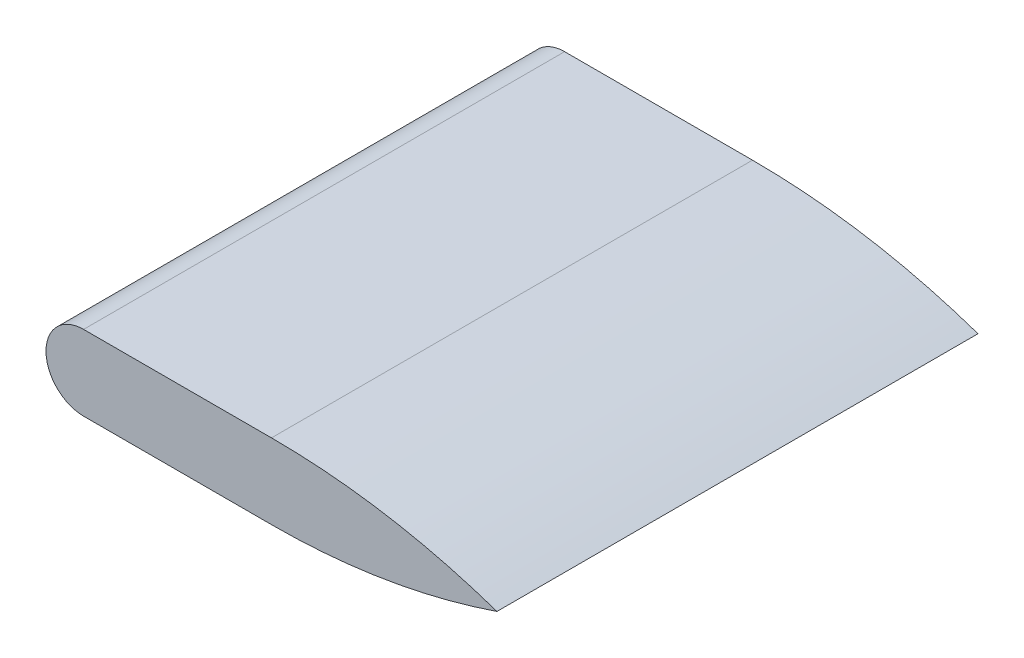
ISO-10303-21;
HEADER;
FILE_DESCRIPTION(('STEP AP214'),'2;1');
FILE_NAME('part.step','',(''),(''),'','','');
FILE_SCHEMA(('AUTOMOTIVE_DESIGN { 1 0 10303 214 1 1 1 1 }'));
ENDSEC;
DATA;
#1=APPLICATION_CONTEXT('core data for automotive mechanical design processes');
#2=APPLICATION_PROTOCOL_DEFINITION('international standard','automotive_design',2000,#1);
#3=PRODUCT_CONTEXT('',#1,'mechanical');
#4=PRODUCT('Part','Part','',(#3));
#5=PRODUCT_RELATED_PRODUCT_CATEGORY('part','',(#4));
#6=PRODUCT_DEFINITION_FORMATION('','',#4);
#7=PRODUCT_DEFINITION_CONTEXT('part definition',#1,'design');
#8=PRODUCT_DEFINITION('design','',#6,#7);
#9=PRODUCT_DEFINITION_SHAPE('','',#8);
#10=(LENGTH_UNIT() NAMED_UNIT(*) SI_UNIT(.MILLI.,.METRE.));
#11=(NAMED_UNIT(*) PLANE_ANGLE_UNIT() SI_UNIT($,.RADIAN.));
#12=(NAMED_UNIT(*) SI_UNIT($,.STERADIAN.) SOLID_ANGLE_UNIT());
#13=UNCERTAINTY_MEASURE_WITH_UNIT(LENGTH_MEASURE(1.E-05),#10,'distance_accuracy_value','');
#14=(GEOMETRIC_REPRESENTATION_CONTEXT(3) GLOBAL_UNCERTAINTY_ASSIGNED_CONTEXT((#13)) GLOBAL_UNIT_ASSIGNED_CONTEXT((#10,
#11,#12)) REPRESENTATION_CONTEXT('',''));
#15=CARTESIAN_POINT('',(0.,0.,0.));
#16=DIRECTION('',(0.,0.,1.));
#17=DIRECTION('',(1.,0.,0.));
#18=AXIS2_PLACEMENT_3D('',#15,#16,#17);
#19=CARTESIAN_POINT('',(-37.240452993692,26.2356559287821,32.));
#20=DIRECTION('',(0.,0.,-1.));
#21=DIRECTION('',(-1.,0.,0.));
#22=AXIS2_PLACEMENT_3D('',#19,#20,#21);
#23=CYLINDRICAL_SURFACE('',#22,2.5);
#24=CARTESIAN_POINT('',(-37.240452993692,26.2356559287821,0.));
#25=DIRECTION('',(0.,0.,1.));
#26=DIRECTION('',(1.,0.,0.));
#27=AXIS2_PLACEMENT_3D('',#24,#25,#26);
#28=CIRCLE('',#27,2.5);
#29=CARTESIAN_POINT('',(-37.240452993692,28.7356559287821,0.));
#30=VERTEX_POINT('',#29);
#31=CARTESIAN_POINT('',(-37.240452993692,23.7356559287821,0.));
#32=VERTEX_POINT('',#31);
#33=EDGE_CURVE('E119',#30,#32,#28,.T.);
#34=ORIENTED_EDGE('',*,*,#33,.T.);
#35=DIRECTION('',(0.,0.,-1.));
#36=VECTOR('',#35,1.);
#37=CARTESIAN_POINT('',(-37.240452993692,23.7356559287821,32.));
#38=LINE('',#37,#36);
#39=CARTESIAN_POINT('',(-37.240452993692,23.7356559287821,32.));
#40=VERTEX_POINT('',#39);
#41=EDGE_CURVE('E11',#40,#32,#38,.T.);
#42=ORIENTED_EDGE('',*,*,#41,.F.);
#43=CARTESIAN_POINT('',(-37.240452993692,26.2356559287821,32.));
#44=DIRECTION('',(0.,0.,1.));
#45=DIRECTION('',(1.,0.,0.));
#46=AXIS2_PLACEMENT_3D('',#43,#44,#45);
#47=CIRCLE('',#46,2.5);
#48=CARTESIAN_POINT('',(-37.240452993692,28.7356559287821,32.));
#49=VERTEX_POINT('',#48);
#50=EDGE_CURVE('E129',#49,#40,#47,.T.);
#51=ORIENTED_EDGE('',*,*,#50,.F.);
#52=DIRECTION('',(0.,0.,-1.));
#53=VECTOR('',#52,1.);
#54=CARTESIAN_POINT('',(-37.240452993692,28.7356559287821,32.));
#55=LINE('',#54,#53);
#56=EDGE_CURVE('E115',#49,#30,#55,.T.);
#57=ORIENTED_EDGE('',*,*,#56,.T.);
#58=EDGE_LOOP('',(#34,#42,#51,#57));
#59=FACE_BOUND('',#58,.T.);
#60=ADVANCED_FACE('F33',(#59),#23,.T.);
#61=CARTESIAN_POINT('',(-37.240452993692,23.7356559287821,32.));
#62=DIRECTION('',(0.,1.,0.));
#63=DIRECTION('',(0.,0.,1.));
#64=AXIS2_PLACEMENT_3D('',#61,#62,#63);
#65=PLANE('',#64);
#66=DIRECTION('',(1.,0.,0.));
#67=VECTOR('',#66,1.);
#68=CARTESIAN_POINT('',(-37.240452993692,23.7356559287821,0.));
#69=LINE('',#68,#67);
#70=CARTESIAN_POINT('',(-24.740452993692,23.7356559287821,0.));
#71=VERTEX_POINT('',#70);
#72=EDGE_CURVE('E122',#32,#71,#69,.T.);
#73=ORIENTED_EDGE('',*,*,#72,.T.);
#74=DIRECTION('',(0.,0.,-1.));
#75=VECTOR('',#74,1.);
#76=CARTESIAN_POINT('',(-24.740452993692,23.7356559287821,32.));
#77=LINE('',#76,#75);
#78=CARTESIAN_POINT('',(-24.740452993692,23.7356559287821,32.));
#79=VERTEX_POINT('',#78);
#80=EDGE_CURVE('E40',#79,#71,#77,.T.);
#81=ORIENTED_EDGE('',*,*,#80,.F.);
#82=DIRECTION('',(1.,0.,0.));
#83=VECTOR('',#82,1.);
#84=CARTESIAN_POINT('',(-37.240452993692,23.7356559287821,32.));
#85=LINE('',#84,#83);
#86=EDGE_CURVE('E88',#40,#79,#85,.T.);
#87=ORIENTED_EDGE('',*,*,#86,.F.);
#88=ORIENTED_EDGE('',*,*,#41,.T.);
#89=EDGE_LOOP('',(#73,#81,#87,#88));
#90=FACE_BOUND('',#89,.T.);
#91=ADVANCED_FACE('F210',(#90),#65,.F.);
#92=CARTESIAN_POINT('',(-24.740452993692,69.9856559287822,32.));
#93=DIRECTION('',(0.,0.,-1.));
#94=DIRECTION('',(-1.,0.,0.));
#95=AXIS2_PLACEMENT_3D('',#92,#93,#94);
#96=CYLINDRICAL_SURFACE('',#95,46.2500000000001);
#97=CARTESIAN_POINT('',(-24.740452993692,69.9856559287822,0.));
#98=DIRECTION('',(0.,0.,1.));
#99=DIRECTION('',(1.,0.,0.));
#100=AXIS2_PLACEMENT_3D('',#97,#98,#99);
#101=CIRCLE('',#100,46.2500000000001);
#102=CARTESIAN_POINT('',(-9.74045299369199,26.2356559287821,0.));
#103=VERTEX_POINT('',#102);
#104=EDGE_CURVE('E108',#71,#103,#101,.T.);
#105=ORIENTED_EDGE('',*,*,#104,.T.);
#106=DIRECTION('',(0.,0.,-1.));
#107=VECTOR('',#106,1.);
#108=CARTESIAN_POINT('',(-9.74045299369199,26.2356559287821,32.));
#109=LINE('',#108,#107);
#110=CARTESIAN_POINT('',(-9.74045299369199,26.2356559287821,32.));
#111=VERTEX_POINT('',#110);
#112=EDGE_CURVE('E105',#111,#103,#109,.T.);
#113=ORIENTED_EDGE('',*,*,#112,.F.);
#114=CARTESIAN_POINT('',(-24.740452993692,69.9856559287822,32.));
#115=DIRECTION('',(0.,0.,1.));
#116=DIRECTION('',(1.,0.,0.));
#117=AXIS2_PLACEMENT_3D('',#114,#115,#116);
#118=CIRCLE('',#117,46.2500000000001);
#119=EDGE_CURVE('E95',#79,#111,#118,.T.);
#120=ORIENTED_EDGE('',*,*,#119,.F.);
#121=ORIENTED_EDGE('',*,*,#80,.T.);
#122=EDGE_LOOP('',(#105,#113,#120,#121));
#123=FACE_BOUND('',#122,.T.);
#124=ADVANCED_FACE('F106',(#123),#96,.T.);
#125=CARTESIAN_POINT('',(-24.740452993692,-17.514344071218,32.));
#126=DIRECTION('',(0.,0.,-1.));
#127=DIRECTION('',(-1.,0.,0.));
#128=AXIS2_PLACEMENT_3D('',#125,#126,#127);
#129=CYLINDRICAL_SURFACE('',#128,46.2500000000001);
#130=CARTESIAN_POINT('',(-24.740452993692,-17.514344071218,0.));
#131=DIRECTION('',(0.,0.,1.));
#132=DIRECTION('',(1.,0.,0.));
#133=AXIS2_PLACEMENT_3D('',#130,#131,#132);
#134=CIRCLE('',#133,46.2500000000001);
#135=CARTESIAN_POINT('',(-24.740452993692,28.7356559287821,0.));
#136=VERTEX_POINT('',#135);
#137=EDGE_CURVE('E126',#103,#136,#134,.T.);
#138=ORIENTED_EDGE('',*,*,#137,.T.);
#139=DIRECTION('',(0.,0.,-1.));
#140=VECTOR('',#139,1.);
#141=CARTESIAN_POINT('',(-24.740452993692,28.7356559287821,32.));
#142=LINE('',#141,#140);
#143=CARTESIAN_POINT('',(-24.740452993692,28.7356559287821,32.));
#144=VERTEX_POINT('',#143);
#145=EDGE_CURVE('E111',#144,#136,#142,.T.);
#146=ORIENTED_EDGE('',*,*,#145,.F.);
#147=CARTESIAN_POINT('',(-24.740452993692,-17.514344071218,32.));
#148=DIRECTION('',(0.,0.,1.));
#149=DIRECTION('',(1.,0.,0.));
#150=AXIS2_PLACEMENT_3D('',#147,#148,#149);
#151=CIRCLE('',#150,46.2500000000001);
#152=EDGE_CURVE('E99',#111,#144,#151,.T.);
#153=ORIENTED_EDGE('',*,*,#152,.F.);
#154=ORIENTED_EDGE('',*,*,#112,.T.);
#155=EDGE_LOOP('',(#138,#146,#153,#154));
#156=FACE_BOUND('',#155,.T.);
#157=ADVANCED_FACE('F113',(#156),#129,.T.);
#158=CARTESIAN_POINT('',(-37.240452993692,28.7356559287821,32.));
#159=DIRECTION('',(0.,-1.,0.));
#160=DIRECTION('',(0.,0.,-1.));
#161=AXIS2_PLACEMENT_3D('',#158,#159,#160);
#162=PLANE('',#161);
#163=DIRECTION('',(-1.,0.,0.));
#164=VECTOR('',#163,1.);
#165=CARTESIAN_POINT('',(-37.240452993692,28.7356559287821,0.));
#166=LINE('',#165,#164);
#167=EDGE_CURVE('E80',#136,#30,#166,.T.);
#168=ORIENTED_EDGE('',*,*,#167,.T.);
#169=ORIENTED_EDGE('',*,*,#56,.F.);
#170=DIRECTION('',(-1.,0.,0.));
#171=VECTOR('',#170,1.);
#172=CARTESIAN_POINT('',(-37.240452993692,28.7356559287821,32.));
#173=LINE('',#172,#171);
#174=EDGE_CURVE('E56',#144,#49,#173,.T.);
#175=ORIENTED_EDGE('',*,*,#174,.F.);
#176=ORIENTED_EDGE('',*,*,#145,.T.);
#177=EDGE_LOOP('',(#168,#169,#175,#176));
#178=FACE_BOUND('',#177,.T.);
#179=ADVANCED_FACE('F134',(#178),#162,.F.);
#180=CARTESIAN_POINT('',(-37.240452993692,26.2356559287821,32.));
#181=DIRECTION('',(0.,0.,1.));
#182=DIRECTION('',(1.,0.,0.));
#183=AXIS2_PLACEMENT_3D('',#180,#181,#182);
#184=PLANE('',#183);
#185=ORIENTED_EDGE('',*,*,#50,.T.);
#186=ORIENTED_EDGE('',*,*,#86,.T.);
#187=ORIENTED_EDGE('',*,*,#119,.T.);
#188=ORIENTED_EDGE('',*,*,#152,.T.);
#189=ORIENTED_EDGE('',*,*,#174,.T.);
#190=EDGE_LOOP('',(#185,#186,#187,#188,#189));
#191=FACE_BOUND('',#190,.T.);
#192=ADVANCED_FACE('F97',(#191),#184,.T.);
#193=CARTESIAN_POINT('',(-37.240452993692,26.2356559287821,0.));
#194=DIRECTION('',(0.,0.,1.));
#195=DIRECTION('',(1.,0.,0.));
#196=AXIS2_PLACEMENT_3D('',#193,#194,#195);
#197=PLANE('',#196);
#198=DIRECTION('',(1.,0.,0.));
#199=VECTOR('',#198,1.);
#200=CARTESIAN_POINT('',(-37.240452993692,27.2356559287821,0.));
#201=LINE('',#200,#199);
#202=CARTESIAN_POINT('',(-37.240452993692,27.2356559287821,0.));
#203=VERTEX_POINT('',#202);
#204=CARTESIAN_POINT('',(-27.240452993692,27.2356559287821,0.));
#205=VERTEX_POINT('',#204);
#206=EDGE_CURVE('E157',#203,#205,#201,.T.);
#207=ORIENTED_EDGE('',*,*,#206,.F.);
#208=CARTESIAN_POINT('',(-37.240452993692,26.2356559287821,0.));
#209=DIRECTION('',(0.,0.,-1.));
#210=DIRECTION('',(-1.,0.,0.));
#211=AXIS2_PLACEMENT_3D('',#208,#209,#210);
#212=CIRCLE('',#211,0.999999999999999);
#213=CARTESIAN_POINT('',(-37.240452993692,25.2356559287821,0.));
#214=VERTEX_POINT('',#213);
#215=EDGE_CURVE('E47',#214,#203,#212,.T.);
#216=ORIENTED_EDGE('',*,*,#215,.F.);
#217=DIRECTION('',(-1.,0.,0.));
#218=VECTOR('',#217,1.);
#219=CARTESIAN_POINT('',(-37.240452993692,25.2356559287821,0.));
#220=LINE('',#219,#218);
#221=CARTESIAN_POINT('',(-27.240452993692,25.2356559287821,0.));
#222=VERTEX_POINT('',#221);
#223=EDGE_CURVE('E150',#222,#214,#220,.T.);
#224=ORIENTED_EDGE('',*,*,#223,.F.);
#225=DIRECTION('',(0.,-1.,0.));
#226=VECTOR('',#225,1.);
#227=CARTESIAN_POINT('',(-27.240452993692,25.2356559287821,0.));
#228=LINE('',#227,#226);
#229=EDGE_CURVE('E154',#205,#222,#228,.T.);
#230=ORIENTED_EDGE('',*,*,#229,.F.);
#231=EDGE_LOOP('',(#207,#216,#224,#230));
#232=FACE_BOUND('',#231,.T.);
#233=ORIENTED_EDGE('',*,*,#33,.F.);
#234=ORIENTED_EDGE('',*,*,#167,.F.);
#235=ORIENTED_EDGE('',*,*,#137,.F.);
#236=ORIENTED_EDGE('',*,*,#104,.F.);
#237=ORIENTED_EDGE('',*,*,#72,.F.);
#238=EDGE_LOOP('',(#233,#234,#235,#236,#237));
#239=FACE_BOUND('',#238,.T.);
#240=ADVANCED_FACE('F133',(#232,#239),#197,.F.);
#241=CARTESIAN_POINT('',(-37.240452993692,26.2356559287821,25.));
#242=DIRECTION('',(0.,0.,-1.));
#243=DIRECTION('',(-1.,0.,0.));
#244=AXIS2_PLACEMENT_3D('',#241,#242,#243);
#245=CYLINDRICAL_SURFACE('',#244,0.999999999999999);
#246=ORIENTED_EDGE('',*,*,#215,.T.);
#247=DIRECTION('',(0.,0.,-1.));
#248=VECTOR('',#247,1.);
#249=CARTESIAN_POINT('',(-37.240452993692,27.2356559287821,25.));
#250=LINE('',#249,#248);
#251=CARTESIAN_POINT('',(-37.240452993692,27.2356559287821,25.));
#252=VERTEX_POINT('',#251);
#253=EDGE_CURVE('E140',#252,#203,#250,.T.);
#254=ORIENTED_EDGE('',*,*,#253,.F.);
#255=CARTESIAN_POINT('',(-37.240452993692,26.2356559287821,25.));
#256=DIRECTION('',(0.,0.,-1.));
#257=DIRECTION('',(-1.,0.,0.));
#258=AXIS2_PLACEMENT_3D('',#255,#256,#257);
#259=CIRCLE('',#258,0.999999999999999);
#260=CARTESIAN_POINT('',(-37.240452993692,25.2356559287821,25.));
#261=VERTEX_POINT('',#260);
#262=EDGE_CURVE('E153',#261,#252,#259,.T.);
#263=ORIENTED_EDGE('',*,*,#262,.F.);
#264=DIRECTION('',(0.,0.,-1.));
#265=VECTOR('',#264,1.);
#266=CARTESIAN_POINT('',(-37.240452993692,25.2356559287821,25.));
#267=LINE('',#266,#265);
#268=EDGE_CURVE('E123',#261,#214,#267,.T.);
#269=ORIENTED_EDGE('',*,*,#268,.T.);
#270=EDGE_LOOP('',(#246,#254,#263,#269));
#271=FACE_BOUND('',#270,.T.);
#272=ADVANCED_FACE('F178',(#271),#245,.F.);
#273=CARTESIAN_POINT('',(-37.240452993692,25.2356559287821,25.));
#274=DIRECTION('',(0.,-1.,0.));
#275=DIRECTION('',(0.,0.,-1.));
#276=AXIS2_PLACEMENT_3D('',#273,#274,#275);
#277=PLANE('',#276);
#278=ORIENTED_EDGE('',*,*,#223,.T.);
#279=ORIENTED_EDGE('',*,*,#268,.F.);
#280=DIRECTION('',(-1.,0.,0.));
#281=VECTOR('',#280,1.);
#282=CARTESIAN_POINT('',(-37.240452993692,25.2356559287821,25.));
#283=LINE('',#282,#281);
#284=CARTESIAN_POINT('',(-27.240452993692,25.2356559287821,25.));
#285=VERTEX_POINT('',#284);
#286=EDGE_CURVE('E143',#285,#261,#283,.T.);
#287=ORIENTED_EDGE('',*,*,#286,.F.);
#288=DIRECTION('',(0.,0.,-1.));
#289=VECTOR('',#288,1.);
#290=CARTESIAN_POINT('',(-27.240452993692,25.2356559287821,25.));
#291=LINE('',#290,#289);
#292=EDGE_CURVE('E146',#285,#222,#291,.T.);
#293=ORIENTED_EDGE('',*,*,#292,.T.);
#294=EDGE_LOOP('',(#278,#279,#287,#293));
#295=FACE_BOUND('',#294,.T.);
#296=ADVANCED_FACE('F189',(#295),#277,.F.);
#297=CARTESIAN_POINT('',(-27.240452993692,25.2356559287821,25.));
#298=DIRECTION('',(1.,0.,0.));
#299=DIRECTION('',(0.,0.,-1.));
#300=AXIS2_PLACEMENT_3D('',#297,#298,#299);
#301=PLANE('',#300);
#302=ORIENTED_EDGE('',*,*,#229,.T.);
#303=ORIENTED_EDGE('',*,*,#292,.F.);
#304=DIRECTION('',(0.,-1.,0.));
#305=VECTOR('',#304,1.);
#306=CARTESIAN_POINT('',(-27.240452993692,25.2356559287821,25.));
#307=LINE('',#306,#305);
#308=CARTESIAN_POINT('',(-27.240452993692,27.2356559287821,25.));
#309=VERTEX_POINT('',#308);
#310=EDGE_CURVE('E163',#309,#285,#307,.T.);
#311=ORIENTED_EDGE('',*,*,#310,.F.);
#312=DIRECTION('',(0.,0.,-1.));
#313=VECTOR('',#312,1.);
#314=CARTESIAN_POINT('',(-27.240452993692,27.2356559287821,25.));
#315=LINE('',#314,#313);
#316=EDGE_CURVE('E142',#309,#205,#315,.T.);
#317=ORIENTED_EDGE('',*,*,#316,.T.);
#318=EDGE_LOOP('',(#302,#303,#311,#317));
#319=FACE_BOUND('',#318,.T.);
#320=ADVANCED_FACE('F194',(#319),#301,.F.);
#321=CARTESIAN_POINT('',(-37.240452993692,27.2356559287821,25.));
#322=DIRECTION('',(0.,1.,0.));
#323=DIRECTION('',(0.,0.,1.));
#324=AXIS2_PLACEMENT_3D('',#321,#322,#323);
#325=PLANE('',#324);
#326=ORIENTED_EDGE('',*,*,#206,.T.);
#327=ORIENTED_EDGE('',*,*,#316,.F.);
#328=DIRECTION('',(1.,0.,0.));
#329=VECTOR('',#328,1.);
#330=CARTESIAN_POINT('',(-37.240452993692,27.2356559287821,25.));
#331=LINE('',#330,#329);
#332=EDGE_CURVE('E166',#252,#309,#331,.T.);
#333=ORIENTED_EDGE('',*,*,#332,.F.);
#334=ORIENTED_EDGE('',*,*,#253,.T.);
#335=EDGE_LOOP('',(#326,#327,#333,#334));
#336=FACE_BOUND('',#335,.T.);
#337=ADVANCED_FACE('F199',(#336),#325,.F.);
#338=CARTESIAN_POINT('',(-37.240452993692,26.2356559287821,25.));
#339=DIRECTION('',(0.,0.,-1.));
#340=DIRECTION('',(-1.,0.,0.));
#341=AXIS2_PLACEMENT_3D('',#338,#339,#340);
#342=PLANE('',#341);
#343=ORIENTED_EDGE('',*,*,#262,.T.);
#344=ORIENTED_EDGE('',*,*,#332,.T.);
#345=ORIENTED_EDGE('',*,*,#310,.T.);
#346=ORIENTED_EDGE('',*,*,#286,.T.);
#347=EDGE_LOOP('',(#343,#344,#345,#346));
#348=FACE_BOUND('',#347,.T.);
#349=ADVANCED_FACE('F173',(#348),#342,.T.);
#350=CLOSED_SHELL('',(#60,#91,#124,#157,#179,#192,#240,#272,#296,#320,#337,#349));
#351=MANIFOLD_SOLID_BREP('B2',#350);
#352=ADVANCED_BREP_SHAPE_REPRESENTATION('',(#18,#351),#14);
#353=SHAPE_DEFINITION_REPRESENTATION(#9,#352);
ENDSEC;
END-ISO-10303-21;
